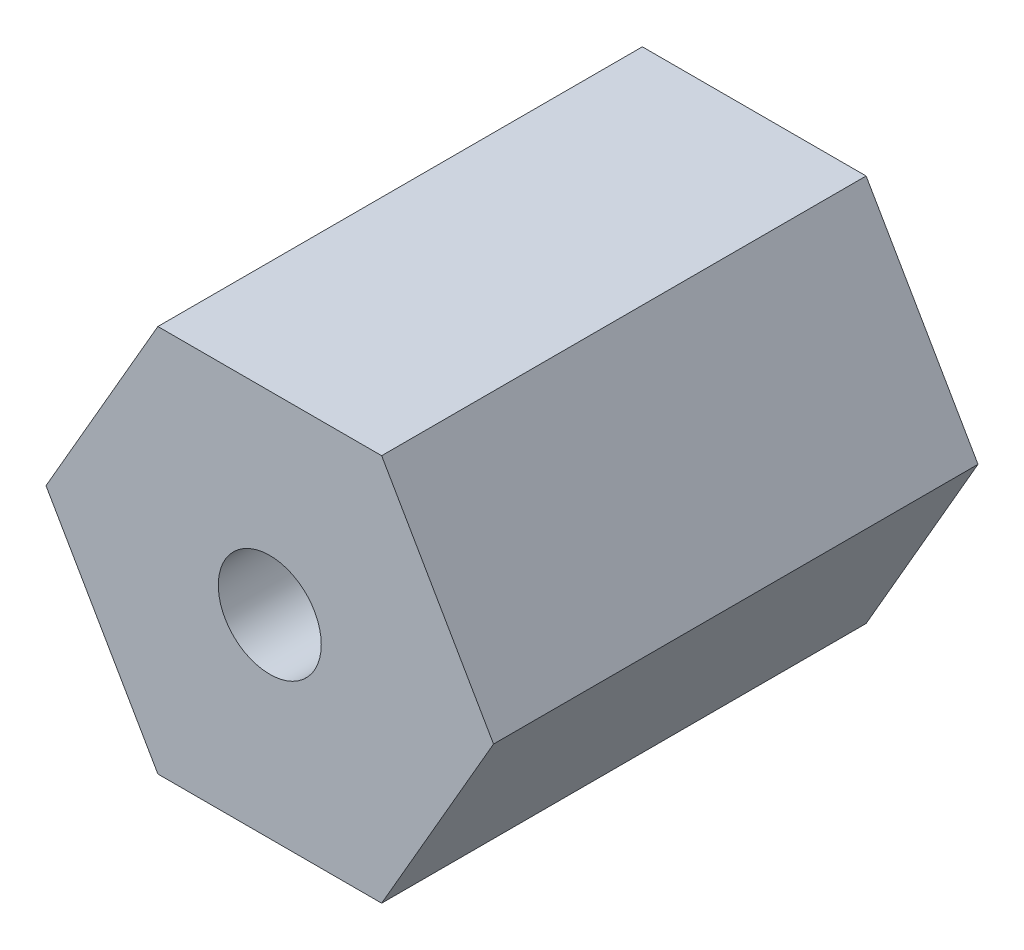
ISO-10303-21;
HEADER;
FILE_DESCRIPTION(('STEP AP214'),'2;1');
FILE_NAME('part.step','',(''),(''),'','','');
FILE_SCHEMA(('AUTOMOTIVE_DESIGN { 1 0 10303 214 1 1 1 1 }'));
ENDSEC;
DATA;
#1=APPLICATION_CONTEXT('core data for automotive mechanical design processes');
#2=APPLICATION_PROTOCOL_DEFINITION('international standard','automotive_design',2000,#1);
#3=PRODUCT_CONTEXT('',#1,'mechanical');
#4=PRODUCT('Part','Part','',(#3));
#5=PRODUCT_RELATED_PRODUCT_CATEGORY('part','',(#4));
#6=PRODUCT_DEFINITION_FORMATION('','',#4);
#7=PRODUCT_DEFINITION_CONTEXT('part definition',#1,'design');
#8=PRODUCT_DEFINITION('design','',#6,#7);
#9=PRODUCT_DEFINITION_SHAPE('','',#8);
#10=(LENGTH_UNIT() NAMED_UNIT(*) SI_UNIT(.MILLI.,.METRE.));
#11=(NAMED_UNIT(*) PLANE_ANGLE_UNIT() SI_UNIT($,.RADIAN.));
#12=(NAMED_UNIT(*) SI_UNIT($,.STERADIAN.) SOLID_ANGLE_UNIT());
#13=UNCERTAINTY_MEASURE_WITH_UNIT(LENGTH_MEASURE(1.E-05),#10,'distance_accuracy_value','');
#14=(GEOMETRIC_REPRESENTATION_CONTEXT(3) GLOBAL_UNCERTAINTY_ASSIGNED_CONTEXT((#13)) GLOBAL_UNIT_ASSIGNED_CONTEXT((#10,
#11,#12)) REPRESENTATION_CONTEXT('',''));
#15=CARTESIAN_POINT('',(0.,0.,0.));
#16=DIRECTION('',(0.,0.,1.));
#17=DIRECTION('',(1.,0.,0.));
#18=AXIS2_PLACEMENT_3D('',#15,#16,#17);
#19=CARTESIAN_POINT('',(4.39940905122495,2.54,12.7));
#20=DIRECTION('',(-0.866025403784439,-0.5,0.));
#21=DIRECTION('',(0.5,-0.866025403784439,0.));
#22=AXIS2_PLACEMENT_3D('',#19,#20,#21);
#23=PLANE('',#22);
#24=DIRECTION('',(-0.5,0.866025403784439,0.));
#25=VECTOR('',#24,1.);
#26=CARTESIAN_POINT('',(4.39940905122495,2.54,0.));
#27=LINE('',#26,#25);
#28=CARTESIAN_POINT('',(5.8658787349666,0.,0.));
#29=VERTEX_POINT('',#28);
#30=CARTESIAN_POINT('',(2.9329393674833,5.08,0.));
#31=VERTEX_POINT('',#30);
#32=EDGE_CURVE('E121',#29,#31,#27,.T.);
#33=ORIENTED_EDGE('',*,*,#32,.T.);
#34=DIRECTION('',(0.,0.,-1.));
#35=VECTOR('',#34,1.);
#36=CARTESIAN_POINT('',(2.9329393674833,5.08,12.7));
#37=LINE('',#36,#35);
#38=CARTESIAN_POINT('',(2.9329393674833,5.08,12.7));
#39=VERTEX_POINT('',#38);
#40=EDGE_CURVE('E11',#39,#31,#37,.T.);
#41=ORIENTED_EDGE('',*,*,#40,.F.);
#42=DIRECTION('',(-0.5,0.866025403784439,0.));
#43=VECTOR('',#42,1.);
#44=CARTESIAN_POINT('',(4.39940905122495,2.54,12.7));
#45=LINE('',#44,#43);
#46=CARTESIAN_POINT('',(5.8658787349666,0.,12.7));
#47=VERTEX_POINT('',#46);
#48=EDGE_CURVE('E132',#47,#39,#45,.T.);
#49=ORIENTED_EDGE('',*,*,#48,.F.);
#50=DIRECTION('',(0.,0.,-1.));
#51=VECTOR('',#50,1.);
#52=CARTESIAN_POINT('',(5.8658787349666,0.,12.7));
#53=LINE('',#52,#51);
#54=EDGE_CURVE('E117',#47,#29,#53,.T.);
#55=ORIENTED_EDGE('',*,*,#54,.T.);
#56=EDGE_LOOP('',(#33,#41,#49,#55));
#57=FACE_BOUND('',#56,.T.);
#58=ADVANCED_FACE('F37',(#57),#23,.F.);
#59=CARTESIAN_POINT('',(0.,5.08,12.7));
#60=DIRECTION('',(0.,-1.,0.));
#61=DIRECTION('',(1.,0.,0.));
#62=AXIS2_PLACEMENT_3D('',#59,#60,#61);
#63=PLANE('',#62);
#64=DIRECTION('',(-1.,0.,0.));
#65=VECTOR('',#64,1.);
#66=CARTESIAN_POINT('',(0.,5.08,0.));
#67=LINE('',#66,#65);
#68=CARTESIAN_POINT('',(-2.9329393674833,5.08,0.));
#69=VERTEX_POINT('',#68);
#70=EDGE_CURVE('E124',#31,#69,#67,.T.);
#71=ORIENTED_EDGE('',*,*,#70,.T.);
#72=DIRECTION('',(0.,0.,-1.));
#73=VECTOR('',#72,1.);
#74=CARTESIAN_POINT('',(-2.9329393674833,5.08,12.7));
#75=LINE('',#74,#73);
#76=CARTESIAN_POINT('',(-2.9329393674833,5.08,12.7));
#77=VERTEX_POINT('',#76);
#78=EDGE_CURVE('E45',#77,#69,#75,.T.);
#79=ORIENTED_EDGE('',*,*,#78,.F.);
#80=DIRECTION('',(-1.,0.,0.));
#81=VECTOR('',#80,1.);
#82=CARTESIAN_POINT('',(0.,5.08,12.7));
#83=LINE('',#82,#81);
#84=EDGE_CURVE('E90',#39,#77,#83,.T.);
#85=ORIENTED_EDGE('',*,*,#84,.F.);
#86=ORIENTED_EDGE('',*,*,#40,.T.);
#87=EDGE_LOOP('',(#71,#79,#85,#86));
#88=FACE_BOUND('',#87,.T.);
#89=ADVANCED_FACE('F157',(#88),#63,.F.);
#90=CARTESIAN_POINT('',(-4.39940905122495,2.54,12.7));
#91=DIRECTION('',(0.866025403784439,-0.5,0.));
#92=DIRECTION('',(0.5,0.866025403784439,0.));
#93=AXIS2_PLACEMENT_3D('',#90,#91,#92);
#94=PLANE('',#93);
#95=DIRECTION('',(-0.5,-0.866025403784439,0.));
#96=VECTOR('',#95,1.);
#97=CARTESIAN_POINT('',(-4.39940905122495,2.54,0.));
#98=LINE('',#97,#96);
#99=CARTESIAN_POINT('',(-5.8658787349666,0.,0.));
#100=VERTEX_POINT('',#99);
#101=EDGE_CURVE('E127',#69,#100,#98,.T.);
#102=ORIENTED_EDGE('',*,*,#101,.T.);
#103=DIRECTION('',(0.,0.,-1.));
#104=VECTOR('',#103,1.);
#105=CARTESIAN_POINT('',(-5.8658787349666,0.,12.7));
#106=LINE('',#105,#104);
#107=CARTESIAN_POINT('',(-5.8658787349666,0.,12.7));
#108=VERTEX_POINT('',#107);
#109=EDGE_CURVE('E112',#108,#100,#106,.T.);
#110=ORIENTED_EDGE('',*,*,#109,.F.);
#111=DIRECTION('',(-0.5,-0.866025403784439,0.));
#112=VECTOR('',#111,1.);
#113=CARTESIAN_POINT('',(-4.39940905122495,2.54,12.7));
#114=LINE('',#113,#112);
#115=EDGE_CURVE('E103',#77,#108,#114,.T.);
#116=ORIENTED_EDGE('',*,*,#115,.F.);
#117=ORIENTED_EDGE('',*,*,#78,.T.);
#118=EDGE_LOOP('',(#102,#110,#116,#117));
#119=FACE_BOUND('',#118,.T.);
#120=ADVANCED_FACE('F138',(#119),#94,.F.);
#121=CARTESIAN_POINT('',(-4.39940905122495,-2.54,12.7));
#122=DIRECTION('',(0.866025403784438,0.5,0.));
#123=DIRECTION('',(-0.5,0.866025403784439,0.));
#124=AXIS2_PLACEMENT_3D('',#121,#122,#123);
#125=PLANE('',#124);
#126=DIRECTION('',(0.5,-0.866025403784439,0.));
#127=VECTOR('',#126,1.);
#128=CARTESIAN_POINT('',(-4.39940905122495,-2.54,0.));
#129=LINE('',#128,#127);
#130=CARTESIAN_POINT('',(-2.9329393674833,-5.08,0.));
#131=VERTEX_POINT('',#130);
#132=EDGE_CURVE('E111',#100,#131,#129,.T.);
#133=ORIENTED_EDGE('',*,*,#132,.T.);
#134=DIRECTION('',(0.,0.,-1.));
#135=VECTOR('',#134,1.);
#136=CARTESIAN_POINT('',(-2.9329393674833,-5.08,12.7));
#137=LINE('',#136,#135);
#138=CARTESIAN_POINT('',(-2.9329393674833,-5.08,12.7));
#139=VERTEX_POINT('',#138);
#140=EDGE_CURVE('E108',#139,#131,#137,.T.);
#141=ORIENTED_EDGE('',*,*,#140,.F.);
#142=DIRECTION('',(0.5,-0.866025403784439,0.));
#143=VECTOR('',#142,1.);
#144=CARTESIAN_POINT('',(-4.39940905122495,-2.54,12.7));
#145=LINE('',#144,#143);
#146=EDGE_CURVE('E97',#108,#139,#145,.T.);
#147=ORIENTED_EDGE('',*,*,#146,.F.);
#148=ORIENTED_EDGE('',*,*,#109,.T.);
#149=EDGE_LOOP('',(#133,#141,#147,#148));
#150=FACE_BOUND('',#149,.T.);
#151=ADVANCED_FACE('F109',(#150),#125,.F.);
#152=CARTESIAN_POINT('',(0.,-5.08,12.7));
#153=DIRECTION('',(0.,1.,0.));
#154=DIRECTION('',(0.,0.,1.));
#155=AXIS2_PLACEMENT_3D('',#152,#153,#154);
#156=PLANE('',#155);
#157=DIRECTION('',(1.,0.,0.));
#158=VECTOR('',#157,1.);
#159=CARTESIAN_POINT('',(0.,-5.08,0.));
#160=LINE('',#159,#158);
#161=CARTESIAN_POINT('',(2.9329393674833,-5.08,0.));
#162=VERTEX_POINT('',#161);
#163=EDGE_CURVE('E76',#131,#162,#160,.T.);
#164=ORIENTED_EDGE('',*,*,#163,.T.);
#165=DIRECTION('',(0.,0.,-1.));
#166=VECTOR('',#165,1.);
#167=CARTESIAN_POINT('',(2.9329393674833,-5.08,12.7));
#168=LINE('',#167,#166);
#169=CARTESIAN_POINT('',(2.9329393674833,-5.08,12.7));
#170=VERTEX_POINT('',#169);
#171=EDGE_CURVE('E113',#170,#162,#168,.T.);
#172=ORIENTED_EDGE('',*,*,#171,.F.);
#173=DIRECTION('',(1.,0.,0.));
#174=VECTOR('',#173,1.);
#175=CARTESIAN_POINT('',(0.,-5.08,12.7));
#176=LINE('',#175,#174);
#177=EDGE_CURVE('E101',#139,#170,#176,.T.);
#178=ORIENTED_EDGE('',*,*,#177,.F.);
#179=ORIENTED_EDGE('',*,*,#140,.T.);
#180=EDGE_LOOP('',(#164,#172,#178,#179));
#181=FACE_BOUND('',#180,.T.);
#182=ADVANCED_FACE('F115',(#181),#156,.F.);
#183=CARTESIAN_POINT('',(4.39940905122495,-2.54,12.7));
#184=DIRECTION('',(-0.866025403784439,0.5,0.));
#185=DIRECTION('',(-0.5,-0.866025403784439,0.));
#186=AXIS2_PLACEMENT_3D('',#183,#184,#185);
#187=PLANE('',#186);
#188=DIRECTION('',(0.5,0.866025403784439,0.));
#189=VECTOR('',#188,1.);
#190=CARTESIAN_POINT('',(4.39940905122495,-2.54,0.));
#191=LINE('',#190,#189);
#192=EDGE_CURVE('E82',#162,#29,#191,.T.);
#193=ORIENTED_EDGE('',*,*,#192,.T.);
#194=ORIENTED_EDGE('',*,*,#54,.F.);
#195=DIRECTION('',(0.5,0.866025403784439,0.));
#196=VECTOR('',#195,1.);
#197=CARTESIAN_POINT('',(4.39940905122495,-2.54,12.7));
#198=LINE('',#197,#196);
#199=EDGE_CURVE('E53',#170,#47,#198,.T.);
#200=ORIENTED_EDGE('',*,*,#199,.F.);
#201=ORIENTED_EDGE('',*,*,#171,.T.);
#202=EDGE_LOOP('',(#193,#194,#200,#201));
#203=FACE_BOUND('',#202,.T.);
#204=ADVANCED_FACE('F145',(#203),#187,.F.);
#205=CARTESIAN_POINT('',(0.,0.,12.7));
#206=DIRECTION('',(0.,0.,1.));
#207=DIRECTION('',(1.,0.,0.));
#208=AXIS2_PLACEMENT_3D('',#205,#206,#207);
#209=PLANE('',#208);
#210=CARTESIAN_POINT('',(0.,0.,12.7));
#211=DIRECTION('',(0.,0.,1.));
#212=DIRECTION('',(1.,0.,0.));
#213=AXIS2_PLACEMENT_3D('',#210,#211,#212);
#214=CIRCLE('',#213,1.34999999999999);
#215=CARTESIAN_POINT('',(1.34999999999999,0.,12.7));
#216=VERTEX_POINT('',#215);
#217=EDGE_CURVE('E216',#216,#216,#214,.T.);
#218=ORIENTED_EDGE('',*,*,#217,.F.);
#219=EDGE_LOOP('',(#218));
#220=FACE_BOUND('',#219,.T.);
#221=ORIENTED_EDGE('',*,*,#48,.T.);
#222=ORIENTED_EDGE('',*,*,#84,.T.);
#223=ORIENTED_EDGE('',*,*,#115,.T.);
#224=ORIENTED_EDGE('',*,*,#146,.T.);
#225=ORIENTED_EDGE('',*,*,#177,.T.);
#226=ORIENTED_EDGE('',*,*,#199,.T.);
#227=EDGE_LOOP('',(#221,#222,#223,#224,#225,#226));
#228=FACE_BOUND('',#227,.T.);
#229=ADVANCED_FACE('F99',(#220,#228),#209,.T.);
#230=CARTESIAN_POINT('',(0.,0.,0.));
#231=DIRECTION('',(0.,0.,1.));
#232=DIRECTION('',(1.,0.,0.));
#233=AXIS2_PLACEMENT_3D('',#230,#231,#232);
#234=PLANE('',#233);
#235=CARTESIAN_POINT('',(0.,0.,0.));
#236=DIRECTION('',(0.,0.,1.));
#237=DIRECTION('',(1.,0.,0.));
#238=AXIS2_PLACEMENT_3D('',#235,#236,#237);
#239=CIRCLE('',#238,1.35);
#240=CARTESIAN_POINT('',(1.35,0.,0.));
#241=VERTEX_POINT('',#240);
#242=EDGE_CURVE('E125',#241,#241,#239,.T.);
#243=ORIENTED_EDGE('',*,*,#242,.T.);
#244=EDGE_LOOP('',(#243));
#245=FACE_BOUND('',#244,.T.);
#246=ORIENTED_EDGE('',*,*,#32,.F.);
#247=ORIENTED_EDGE('',*,*,#192,.F.);
#248=ORIENTED_EDGE('',*,*,#163,.F.);
#249=ORIENTED_EDGE('',*,*,#132,.F.);
#250=ORIENTED_EDGE('',*,*,#101,.F.);
#251=ORIENTED_EDGE('',*,*,#70,.F.);
#252=EDGE_LOOP('',(#246,#247,#248,#249,#250,#251));
#253=FACE_BOUND('',#252,.T.);
#254=ADVANCED_FACE('F141',(#245,#253),#234,.F.);
#255=CARTESIAN_POINT('',(0.,0.,12.7));
#256=DIRECTION('',(0.,0.,1.));
#257=DIRECTION('',(1.,0.,0.));
#258=AXIS2_PLACEMENT_3D('',#255,#256,#257);
#259=CYLINDRICAL_SURFACE('',#258,1.34999999999999);
#260=ORIENTED_EDGE('',*,*,#242,.F.);
#261=EDGE_LOOP('',(#260));
#262=FACE_BOUND('',#261,.T.);
#263=ORIENTED_EDGE('',*,*,#217,.T.);
#264=EDGE_LOOP('',(#263));
#265=FACE_BOUND('',#264,.T.);
#266=ADVANCED_FACE('F197',(#262,#265),#259,.F.);
#267=CLOSED_SHELL('',(#58,#89,#120,#151,#182,#204,#229,#254,#266));
#268=MANIFOLD_SOLID_BREP('B2',#267);
#269=ADVANCED_BREP_SHAPE_REPRESENTATION('',(#18,#268),#14);
#270=SHAPE_DEFINITION_REPRESENTATION(#9,#269);
ENDSEC;
END-ISO-10303-21;
